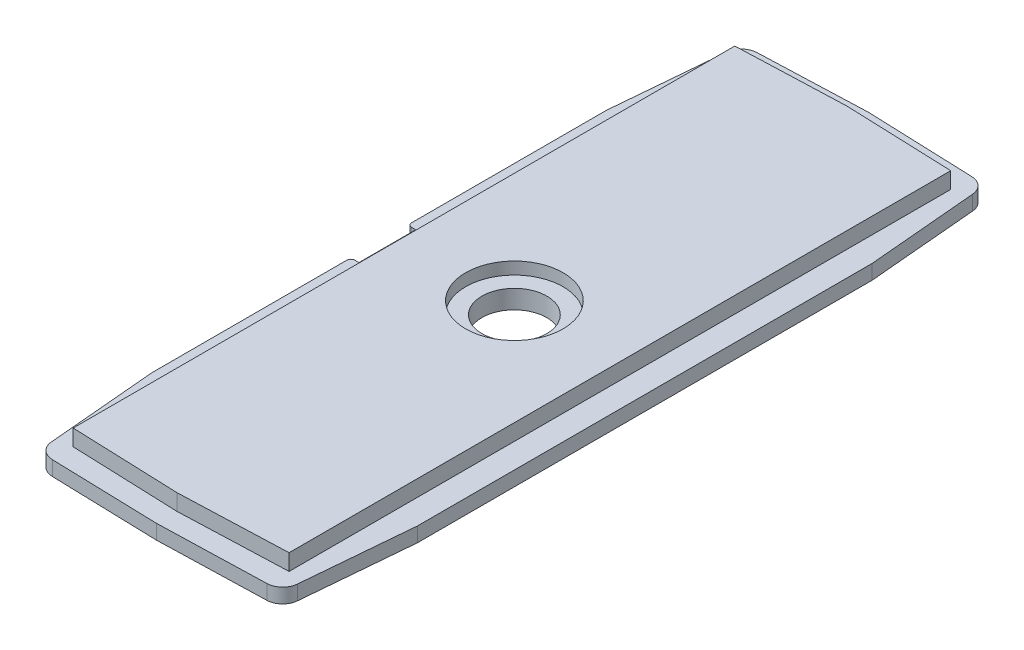
ISO-10303-21;
HEADER;
FILE_DESCRIPTION(('STEP AP214'),'2;1');
FILE_NAME('part.step','',(''),(''),'','','');
FILE_SCHEMA(('AUTOMOTIVE_DESIGN { 1 0 10303 214 1 1 1 1 }'));
ENDSEC;
DATA;
#1=APPLICATION_CONTEXT('core data for automotive mechanical design processes');
#2=APPLICATION_PROTOCOL_DEFINITION('international standard','automotive_design',2000,#1);
#3=PRODUCT_CONTEXT('',#1,'mechanical');
#4=PRODUCT('Part','Part','',(#3));
#5=PRODUCT_RELATED_PRODUCT_CATEGORY('part','',(#4));
#6=PRODUCT_DEFINITION_FORMATION('','',#4);
#7=PRODUCT_DEFINITION_CONTEXT('part definition',#1,'design');
#8=PRODUCT_DEFINITION('design','',#6,#7);
#9=PRODUCT_DEFINITION_SHAPE('','',#8);
#10=(LENGTH_UNIT() NAMED_UNIT(*) SI_UNIT(.MILLI.,.METRE.));
#11=(NAMED_UNIT(*) PLANE_ANGLE_UNIT() SI_UNIT($,.RADIAN.));
#12=(NAMED_UNIT(*) SI_UNIT($,.STERADIAN.) SOLID_ANGLE_UNIT());
#13=UNCERTAINTY_MEASURE_WITH_UNIT(LENGTH_MEASURE(1.E-05),#10,'distance_accuracy_value','');
#14=(GEOMETRIC_REPRESENTATION_CONTEXT(3) GLOBAL_UNCERTAINTY_ASSIGNED_CONTEXT((#13)) GLOBAL_UNIT_ASSIGNED_CONTEXT((#10,
#11,#12)) REPRESENTATION_CONTEXT('',''));
#15=CARTESIAN_POINT('',(0.,0.,0.));
#16=DIRECTION('',(0.,0.,1.));
#17=DIRECTION('',(1.,0.,0.));
#18=AXIS2_PLACEMENT_3D('',#15,#16,#17);
#19=CARTESIAN_POINT('',(0.300000000000007,-0.2,0.));
#20=DIRECTION('',(0.,1.,0.));
#21=DIRECTION('',(0.,0.,1.));
#22=AXIS2_PLACEMENT_3D('',#19,#20,#21);
#23=CYLINDRICAL_SURFACE('',#22,4.);
#24=CARTESIAN_POINT('',(0.300000000000007,0.,0.));
#25=DIRECTION('',(0.,1.,0.));
#26=DIRECTION('',(0.,0.,1.));
#27=AXIS2_PLACEMENT_3D('',#24,#25,#26);
#28=CIRCLE('',#27,4.);
#29=CARTESIAN_POINT('',(0.300000000000007,0.,4.));
#30=VERTEX_POINT('',#29);
#31=EDGE_CURVE('E226',#30,#30,#28,.T.);
#32=ORIENTED_EDGE('',*,*,#31,.F.);
#33=EDGE_LOOP('',(#32));
#34=FACE_BOUND('',#33,.T.);
#35=CARTESIAN_POINT('',(0.300000000000007,2.3,0.));
#36=DIRECTION('',(0.,1.,0.));
#37=DIRECTION('',(0.,0.,1.));
#38=AXIS2_PLACEMENT_3D('',#35,#36,#37);
#39=CIRCLE('',#38,4.);
#40=CARTESIAN_POINT('',(0.300000000000007,2.3,4.));
#41=VERTEX_POINT('',#40);
#42=EDGE_CURVE('E35',#41,#41,#39,.F.);
#43=ORIENTED_EDGE('',*,*,#42,.F.);
#44=EDGE_LOOP('',(#43));
#45=FACE_BOUND('',#44,.T.);
#46=ADVANCED_FACE('F31',(#34,#45),#23,.F.);
#47=CARTESIAN_POINT('',(-15.85,1.8,-4.));
#48=DIRECTION('',(0.,1.,0.));
#49=DIRECTION('',(0.,0.,1.));
#50=AXIS2_PLACEMENT_3D('',#47,#48,#49);
#51=PLANE('',#50);
#52=DIRECTION('',(0.99958153428252,0.,-0.0289267405941802));
#53=VECTOR('',#52,1.);
#54=CARTESIAN_POINT('',(0.,1.8,43.7846989275499));
#55=LINE('',#54,#53);
#56=CARTESIAN_POINT('',(0.,1.8,43.7846989275499));
#57=VERTEX_POINT('',#56);
#58=CARTESIAN_POINT('',(13.2214227765586,1.8,43.4020861502761));
#59=VERTEX_POINT('',#58);
#60=EDGE_CURVE('E269',#57,#59,#55,.T.);
#61=ORIENTED_EDGE('',*,*,#60,.T.);
#62=CARTESIAN_POINT('',(13.1635692953702,1.8,41.402923081711));
#63=DIRECTION('',(0.,1.,0.));
#64=DIRECTION('',(0.,0.,1.));
#65=AXIS2_PLACEMENT_3D('',#62,#63,#64);
#66=CIRCLE('',#65,2.);
#67=CARTESIAN_POINT('',(15.1558796625118,1.8,41.5781355269885));
#68=VERTEX_POINT('',#67);
#69=EDGE_CURVE('E377',#59,#68,#66,.T.);
#70=ORIENTED_EDGE('',*,*,#69,.T.);
#71=DIRECTION('',(0.0876062226387284,0.,-0.9961551835708));
#72=VECTOR('',#71,1.);
#73=CARTESIAN_POINT('',(15.,1.8,43.3506161698846));
#74=LINE('',#73,#72);
#75=CARTESIAN_POINT('',(16.35,1.8,28.));
#76=VERTEX_POINT('',#75);
#77=EDGE_CURVE('E272',#68,#76,#74,.T.);
#78=ORIENTED_EDGE('',*,*,#77,.T.);
#79=DIRECTION('',(0.,0.,-1.));
#80=VECTOR('',#79,1.);
#81=CARTESIAN_POINT('',(16.35,1.8,28.));
#82=LINE('',#81,#80);
#83=CARTESIAN_POINT('',(16.35,1.8,-28.));
#84=VERTEX_POINT('',#83);
#85=EDGE_CURVE('E274',#76,#84,#82,.T.);
#86=ORIENTED_EDGE('',*,*,#85,.T.);
#87=DIRECTION('',(-0.0876132083473841,0.,-0.996154569192491));
#88=VECTOR('',#87,1.);
#89=CARTESIAN_POINT('',(16.35,1.8,-28.));
#90=LINE('',#89,#88);
#91=CARTESIAN_POINT('',(15.1545183752427,1.8,-41.5925222389507));
#92=VERTEX_POINT('',#91);
#93=EDGE_CURVE('E276',#84,#92,#90,.T.);
#94=ORIENTED_EDGE('',*,*,#93,.T.);
#95=CARTESIAN_POINT('',(13.1622092368577,1.8,-41.4172958222559));
#96=DIRECTION('',(0.,1.,0.));
#97=DIRECTION('',(0.,0.,1.));
#98=AXIS2_PLACEMENT_3D('',#95,#96,#97);
#99=CIRCLE('',#98,2.);
#100=CARTESIAN_POINT('',(13.2376113695261,1.8,-43.4158739464204));
#101=VERTEX_POINT('',#100);
#102=EDGE_CURVE('E372',#92,#101,#99,.T.);
#103=ORIENTED_EDGE('',*,*,#102,.T.);
#104=DIRECTION('',(-0.999289062082271,0.,-0.0377010663341814));
#105=VECTOR('',#104,1.);
#106=CARTESIAN_POINT('',(15.,1.8,-43.3493827446398));
#107=LINE('',#106,#105);
#108=CARTESIAN_POINT('',(0.,1.8,-43.9153010724501));
#109=VERTEX_POINT('',#108);
#110=EDGE_CURVE('E279',#101,#109,#107,.T.);
#111=ORIENTED_EDGE('',*,*,#110,.T.);
#112=DIRECTION('',(-0.999289062082271,0.,0.0377010663341814));
#113=VECTOR('',#112,1.);
#114=CARTESIAN_POINT('',(0.,1.8,-43.9153010724501));
#115=LINE('',#114,#113);
#116=CARTESIAN_POINT('',(-13.2376113695261,1.8,-43.4158739464204));
#117=VERTEX_POINT('',#116);
#118=EDGE_CURVE('E281',#109,#117,#115,.T.);
#119=ORIENTED_EDGE('',*,*,#118,.T.);
#120=CARTESIAN_POINT('',(-13.1622092368577,1.8,-41.4172958222559));
#121=DIRECTION('',(0.,1.,0.));
#122=DIRECTION('',(0.,0.,1.));
#123=AXIS2_PLACEMENT_3D('',#120,#121,#122);
#124=CIRCLE('',#123,2.);
#125=CARTESIAN_POINT('',(-15.1545183752427,1.8,-41.5925222389507));
#126=VERTEX_POINT('',#125);
#127=EDGE_CURVE('E47',#117,#126,#124,.T.);
#128=ORIENTED_EDGE('',*,*,#127,.T.);
#129=DIRECTION('',(-0.0876132083473841,0.,0.996154569192491));
#130=VECTOR('',#129,1.);
#131=CARTESIAN_POINT('',(-15.,1.8,-43.3493827446398));
#132=LINE('',#131,#130);
#133=CARTESIAN_POINT('',(-16.35,1.8,-28.));
#134=VERTEX_POINT('',#133);
#135=EDGE_CURVE('E283',#126,#134,#132,.T.);
#136=ORIENTED_EDGE('',*,*,#135,.T.);
#137=DIRECTION('',(0.,0.,1.));
#138=VECTOR('',#137,1.);
#139=CARTESIAN_POINT('',(-16.35,1.8,-28.));
#140=LINE('',#139,#138);
#141=CARTESIAN_POINT('',(-16.35,1.8,-4.));
#142=VERTEX_POINT('',#141);
#143=EDGE_CURVE('E285',#134,#142,#140,.T.);
#144=ORIENTED_EDGE('',*,*,#143,.T.);
#145=CARTESIAN_POINT('',(-15.85,1.8,-4.));
#146=DIRECTION('',(0.,1.,0.));
#147=DIRECTION('',(0.,0.,1.));
#148=AXIS2_PLACEMENT_3D('',#145,#146,#147);
#149=CIRCLE('',#148,0.5);
#150=CARTESIAN_POINT('',(-15.85,1.8,-3.5));
#151=VERTEX_POINT('',#150);
#152=EDGE_CURVE('E287',#142,#151,#149,.T.);
#153=ORIENTED_EDGE('',*,*,#152,.T.);
#154=DIRECTION('',(1.,0.,0.));
#155=VECTOR('',#154,1.);
#156=CARTESIAN_POINT('',(-15.35,1.8,-3.5));
#157=LINE('',#156,#155);
#158=CARTESIAN_POINT('',(-15.35,1.8,-3.5));
#159=VERTEX_POINT('',#158);
#160=EDGE_CURVE('E252',#151,#159,#157,.T.);
#161=ORIENTED_EDGE('',*,*,#160,.T.);
#162=DIRECTION('',(0.,0.,1.));
#163=VECTOR('',#162,1.);
#164=CARTESIAN_POINT('',(-15.35,1.8,-3.5));
#165=LINE('',#164,#163);
#166=CARTESIAN_POINT('',(-15.35,1.8,3.5));
#167=VERTEX_POINT('',#166);
#168=EDGE_CURVE('E255',#159,#167,#165,.T.);
#169=ORIENTED_EDGE('',*,*,#168,.T.);
#170=DIRECTION('',(-1.,0.,0.));
#171=VECTOR('',#170,1.);
#172=CARTESIAN_POINT('',(-15.35,1.8,3.5));
#173=LINE('',#172,#171);
#174=CARTESIAN_POINT('',(-15.85,1.8,3.5));
#175=VERTEX_POINT('',#174);
#176=EDGE_CURVE('E258',#167,#175,#173,.T.);
#177=ORIENTED_EDGE('',*,*,#176,.T.);
#178=CARTESIAN_POINT('',(-15.85,1.8,4.));
#179=DIRECTION('',(0.,1.,0.));
#180=DIRECTION('',(0.,0.,-1.));
#181=AXIS2_PLACEMENT_3D('',#178,#179,#180);
#182=CIRCLE('',#181,0.5);
#183=CARTESIAN_POINT('',(-16.35,1.8,4.));
#184=VERTEX_POINT('',#183);
#185=EDGE_CURVE('E260',#175,#184,#182,.T.);
#186=ORIENTED_EDGE('',*,*,#185,.T.);
#187=DIRECTION('',(0.,0.,1.));
#188=VECTOR('',#187,1.);
#189=CARTESIAN_POINT('',(-16.35,1.8,4.));
#190=LINE('',#189,#188);
#191=CARTESIAN_POINT('',(-16.35,1.8,28.));
#192=VERTEX_POINT('',#191);
#193=EDGE_CURVE('E262',#184,#192,#190,.T.);
#194=ORIENTED_EDGE('',*,*,#193,.T.);
#195=DIRECTION('',(0.0876062226387304,0.,0.996155183570799));
#196=VECTOR('',#195,1.);
#197=CARTESIAN_POINT('',(-16.35,1.8,28.));
#198=LINE('',#197,#196);
#199=CARTESIAN_POINT('',(-15.1558796625118,1.8,41.5781355269885));
#200=VERTEX_POINT('',#199);
#201=EDGE_CURVE('E264',#192,#200,#198,.T.);
#202=ORIENTED_EDGE('',*,*,#201,.T.);
#203=CARTESIAN_POINT('',(-13.1635692953702,1.8,41.402923081711));
#204=DIRECTION('',(0.,1.,0.));
#205=DIRECTION('',(0.,0.,1.));
#206=AXIS2_PLACEMENT_3D('',#203,#204,#205);
#207=CIRCLE('',#206,2.);
#208=CARTESIAN_POINT('',(-13.2214227765585,1.8,43.4020861502761));
#209=VERTEX_POINT('',#208);
#210=EDGE_CURVE('E375',#200,#209,#207,.T.);
#211=ORIENTED_EDGE('',*,*,#210,.T.);
#212=DIRECTION('',(0.99958153428252,0.,0.0289267405941803));
#213=VECTOR('',#212,1.);
#214=CARTESIAN_POINT('',(-15.,1.8,43.3506161698846));
#215=LINE('',#214,#213);
#216=EDGE_CURVE('E267',#209,#57,#215,.T.);
#217=ORIENTED_EDGE('',*,*,#216,.T.);
#218=EDGE_LOOP('',(#61,#70,#78,#86,#94,#103,#111,#119,#128,#136,#144,#153,#161,#169,#177,#186,
#194,#202,#211,#217));
#219=FACE_BOUND('',#218,.T.);
#220=DIRECTION('',(0.,0.,-1.));
#221=VECTOR('',#220,1.);
#222=CARTESIAN_POINT('',(-13.3,1.8,-4.));
#223=LINE('',#222,#221);
#224=CARTESIAN_POINT('',(-13.3,1.8,40.75));
#225=VERTEX_POINT('',#224);
#226=CARTESIAN_POINT('',(-13.3,1.8,-40.75));
#227=VERTEX_POINT('',#226);
#228=EDGE_CURVE('E248',#225,#227,#223,.T.);
#229=ORIENTED_EDGE('',*,*,#228,.T.);
#230=DIRECTION('',(0.999294094305728,0.,-0.0375674471543507));
#231=VECTOR('',#230,1.);
#232=CARTESIAN_POINT('',(-17.2260302585526,1.8,-40.602404877498));
#233=LINE('',#232,#231);
#234=CARTESIAN_POINT('',(0.,1.8,-41.25));
#235=VERTEX_POINT('',#234);
#236=EDGE_CURVE('E230',#227,#235,#233,.T.);
#237=ORIENTED_EDGE('',*,*,#236,.T.);
#238=DIRECTION('',(0.999294094305728,0.,0.0375674471543507));
#239=VECTOR('',#238,1.);
#240=CARTESIAN_POINT('',(-14.4292311166309,1.8,-41.7924522976177));
#241=LINE('',#240,#239);
#242=CARTESIAN_POINT('',(13.3,1.8,-40.75));
#243=VERTEX_POINT('',#242);
#244=EDGE_CURVE('E231',#235,#243,#241,.T.);
#245=ORIENTED_EDGE('',*,*,#244,.T.);
#246=DIRECTION('',(0.,0.,1.));
#247=VECTOR('',#246,1.);
#248=CARTESIAN_POINT('',(13.3,1.8,-4.));
#249=LINE('',#248,#247);
#250=CARTESIAN_POINT('',(13.3,1.8,40.75));
#251=VERTEX_POINT('',#250);
#252=EDGE_CURVE('E234',#243,#251,#249,.T.);
#253=ORIENTED_EDGE('',*,*,#252,.T.);
#254=DIRECTION('',(-0.999294094305728,0.,0.0375674471543507));
#255=VECTOR('',#254,1.);
#256=CARTESIAN_POINT('',(-14.128903691995,1.8,41.7811617929321));
#257=LINE('',#256,#255);
#258=CARTESIAN_POINT('',(0.,1.8,41.25));
#259=VERTEX_POINT('',#258);
#260=EDGE_CURVE('E242',#251,#259,#257,.T.);
#261=ORIENTED_EDGE('',*,*,#260,.T.);
#262=DIRECTION('',(-0.999294094305728,0.,-0.0375674471543507));
#263=VECTOR('',#262,1.);
#264=CARTESIAN_POINT('',(-17.5263576831884,1.8,40.5911143728125));
#265=LINE('',#264,#263);
#266=EDGE_CURVE('E245',#259,#225,#265,.T.);
#267=ORIENTED_EDGE('',*,*,#266,.T.);
#268=EDGE_LOOP('',(#229,#237,#245,#253,#261,#267));
#269=FACE_BOUND('',#268,.T.);
#270=ADVANCED_FACE('F422',(#219,#269),#51,.T.);
#271=CARTESIAN_POINT('',(-15.35,1.8,-3.5));
#272=DIRECTION('',(0.,0.,-1.));
#273=DIRECTION('',(-1.,0.,0.));
#274=AXIS2_PLACEMENT_3D('',#271,#272,#273);
#275=PLANE('',#274);
#276=DIRECTION('',(1.,0.,0.));
#277=VECTOR('',#276,1.);
#278=CARTESIAN_POINT('',(-15.35,0.,-3.5));
#279=LINE('',#278,#277);
#280=CARTESIAN_POINT('',(-15.85,0.,-3.5));
#281=VERTEX_POINT('',#280);
#282=CARTESIAN_POINT('',(-15.35,0.,-3.5));
#283=VERTEX_POINT('',#282);
#284=EDGE_CURVE('E251',#281,#283,#279,.T.);
#285=ORIENTED_EDGE('',*,*,#284,.T.);
#286=DIRECTION('',(0.,-1.,0.));
#287=VECTOR('',#286,1.);
#288=CARTESIAN_POINT('',(-15.35,1.8,-3.5));
#289=LINE('',#288,#287);
#290=EDGE_CURVE('E356',#159,#283,#289,.T.);
#291=ORIENTED_EDGE('',*,*,#290,.F.);
#292=ORIENTED_EDGE('',*,*,#160,.F.);
#293=DIRECTION('',(0.,-1.,0.));
#294=VECTOR('',#293,1.);
#295=CARTESIAN_POINT('',(-15.85,1.8,-3.5));
#296=LINE('',#295,#294);
#297=EDGE_CURVE('E289',#151,#281,#296,.T.);
#298=ORIENTED_EDGE('',*,*,#297,.T.);
#299=EDGE_LOOP('',(#285,#291,#292,#298));
#300=FACE_BOUND('',#299,.T.);
#301=ADVANCED_FACE('F427',(#300),#275,.F.);
#302=CARTESIAN_POINT('',(-15.35,1.8,-3.5));
#303=DIRECTION('',(1.,0.,0.));
#304=DIRECTION('',(0.,0.,-1.));
#305=AXIS2_PLACEMENT_3D('',#302,#303,#304);
#306=PLANE('',#305);
#307=DIRECTION('',(0.,0.,1.));
#308=VECTOR('',#307,1.);
#309=CARTESIAN_POINT('',(-15.35,0.,-3.5));
#310=LINE('',#309,#308);
#311=CARTESIAN_POINT('',(-15.35,0.,3.5));
#312=VERTEX_POINT('',#311);
#313=EDGE_CURVE('E292',#283,#312,#310,.T.);
#314=ORIENTED_EDGE('',*,*,#313,.T.);
#315=DIRECTION('',(0.,-1.,0.));
#316=VECTOR('',#315,1.);
#317=CARTESIAN_POINT('',(-15.35,1.8,3.5));
#318=LINE('',#317,#316);
#319=EDGE_CURVE('E353',#167,#312,#318,.T.);
#320=ORIENTED_EDGE('',*,*,#319,.F.);
#321=ORIENTED_EDGE('',*,*,#168,.F.);
#322=ORIENTED_EDGE('',*,*,#290,.T.);
#323=EDGE_LOOP('',(#314,#320,#321,#322));
#324=FACE_BOUND('',#323,.T.);
#325=ADVANCED_FACE('F429',(#324),#306,.F.);
#326=CARTESIAN_POINT('',(-15.35,1.8,3.5));
#327=DIRECTION('',(0.,0.,1.));
#328=DIRECTION('',(1.,0.,0.));
#329=AXIS2_PLACEMENT_3D('',#326,#327,#328);
#330=PLANE('',#329);
#331=DIRECTION('',(-1.,0.,0.));
#332=VECTOR('',#331,1.);
#333=CARTESIAN_POINT('',(-15.35,0.,3.5));
#334=LINE('',#333,#332);
#335=CARTESIAN_POINT('',(-15.85,0.,3.5));
#336=VERTEX_POINT('',#335);
#337=EDGE_CURVE('E294',#312,#336,#334,.T.);
#338=ORIENTED_EDGE('',*,*,#337,.T.);
#339=DIRECTION('',(0.,-1.,0.));
#340=VECTOR('',#339,1.);
#341=CARTESIAN_POINT('',(-15.85,1.8,3.5));
#342=LINE('',#341,#340);
#343=EDGE_CURVE('E350',#175,#336,#342,.T.);
#344=ORIENTED_EDGE('',*,*,#343,.F.);
#345=ORIENTED_EDGE('',*,*,#176,.F.);
#346=ORIENTED_EDGE('',*,*,#319,.T.);
#347=EDGE_LOOP('',(#338,#344,#345,#346));
#348=FACE_BOUND('',#347,.T.);
#349=ADVANCED_FACE('F434',(#348),#330,.F.);
#350=CARTESIAN_POINT('',(-15.85,1.8,4.));
#351=DIRECTION('',(0.,-1.,0.));
#352=DIRECTION('',(0.,0.,-1.));
#353=AXIS2_PLACEMENT_3D('',#350,#351,#352);
#354=CYLINDRICAL_SURFACE('',#353,0.5);
#355=CARTESIAN_POINT('',(-15.85,0.,4.));
#356=DIRECTION('',(0.,1.,0.));
#357=DIRECTION('',(0.,0.,-1.));
#358=AXIS2_PLACEMENT_3D('',#355,#356,#357);
#359=CIRCLE('',#358,0.5);
#360=CARTESIAN_POINT('',(-16.35,0.,4.));
#361=VERTEX_POINT('',#360);
#362=EDGE_CURVE('E296',#336,#361,#359,.T.);
#363=ORIENTED_EDGE('',*,*,#362,.T.);
#364=DIRECTION('',(0.,-1.,0.));
#365=VECTOR('',#364,1.);
#366=CARTESIAN_POINT('',(-16.35,1.8,4.));
#367=LINE('',#366,#365);
#368=EDGE_CURVE('E347',#184,#361,#367,.T.);
#369=ORIENTED_EDGE('',*,*,#368,.F.);
#370=ORIENTED_EDGE('',*,*,#185,.F.);
#371=ORIENTED_EDGE('',*,*,#343,.T.);
#372=EDGE_LOOP('',(#363,#369,#370,#371));
#373=FACE_BOUND('',#372,.T.);
#374=ADVANCED_FACE('F440',(#373),#354,.T.);
#375=CARTESIAN_POINT('',(-16.35,1.8,4.));
#376=DIRECTION('',(1.,0.,0.));
#377=DIRECTION('',(0.,0.,-1.));
#378=AXIS2_PLACEMENT_3D('',#375,#376,#377);
#379=PLANE('',#378);
#380=DIRECTION('',(0.,0.,1.));
#381=VECTOR('',#380,1.);
#382=CARTESIAN_POINT('',(-16.35,0.,4.));
#383=LINE('',#382,#381);
#384=CARTESIAN_POINT('',(-16.35,0.,28.));
#385=VERTEX_POINT('',#384);
#386=EDGE_CURVE('E298',#361,#385,#383,.T.);
#387=ORIENTED_EDGE('',*,*,#386,.T.);
#388=DIRECTION('',(0.,-1.,0.));
#389=VECTOR('',#388,1.);
#390=CARTESIAN_POINT('',(-16.35,1.8,28.));
#391=LINE('',#390,#389);
#392=EDGE_CURVE('E344',#192,#385,#391,.T.);
#393=ORIENTED_EDGE('',*,*,#392,.F.);
#394=ORIENTED_EDGE('',*,*,#193,.F.);
#395=ORIENTED_EDGE('',*,*,#368,.T.);
#396=EDGE_LOOP('',(#387,#393,#394,#395));
#397=FACE_BOUND('',#396,.T.);
#398=ADVANCED_FACE('F444',(#397),#379,.F.);
#399=CARTESIAN_POINT('',(-16.35,1.8,28.));
#400=DIRECTION('',(0.996155183570799,0.,-0.0876062226387304));
#401=DIRECTION('',(-0.0876062226387304,0.,-0.996155183570799));
#402=AXIS2_PLACEMENT_3D('',#399,#400,#401);
#403=PLANE('',#402);
#404=DIRECTION('',(0.0876062226387304,0.,0.996155183570799));
#405=VECTOR('',#404,1.);
#406=CARTESIAN_POINT('',(-16.35,0.,28.));
#407=LINE('',#406,#405);
#408=CARTESIAN_POINT('',(-15.1558796625118,0.,41.5781355269885));
#409=VERTEX_POINT('',#408);
#410=EDGE_CURVE('E300',#385,#409,#407,.T.);
#411=ORIENTED_EDGE('',*,*,#410,.T.);
#412=DIRECTION('',(0.,-1.,0.));
#413=VECTOR('',#412,1.);
#414=CARTESIAN_POINT('',(-15.1558796625118,1.8,41.5781355269885));
#415=LINE('',#414,#413);
#416=EDGE_CURVE('E382',#409,#200,#415,.F.);
#417=ORIENTED_EDGE('',*,*,#416,.T.);
#418=ORIENTED_EDGE('',*,*,#201,.F.);
#419=ORIENTED_EDGE('',*,*,#392,.T.);
#420=EDGE_LOOP('',(#411,#417,#418,#419));
#421=FACE_BOUND('',#420,.T.);
#422=ADVANCED_FACE('F448',(#421),#403,.F.);
#423=CARTESIAN_POINT('',(-15.,1.8,43.3506161698846));
#424=DIRECTION('',(0.0289267405941803,0.,-0.99958153428252));
#425=DIRECTION('',(-0.99958153428252,0.,-0.0289267405941803));
#426=AXIS2_PLACEMENT_3D('',#423,#424,#425);
#427=PLANE('',#426);
#428=ORIENTED_EDGE('',*,*,#216,.F.);
#429=DIRECTION('',(0.,-1.,0.));
#430=VECTOR('',#429,1.);
#431=CARTESIAN_POINT('',(-13.2214227765585,1.8,43.4020861502761));
#432=LINE('',#431,#430);
#433=CARTESIAN_POINT('',(-13.2214227765585,0.,43.4020861502761));
#434=VERTEX_POINT('',#433);
#435=EDGE_CURVE('E379',#209,#434,#432,.T.);
#436=ORIENTED_EDGE('',*,*,#435,.T.);
#437=DIRECTION('',(0.99958153428252,0.,0.0289267405941803));
#438=VECTOR('',#437,1.);
#439=CARTESIAN_POINT('',(-15.,0.,43.3506161698846));
#440=LINE('',#439,#438);
#441=CARTESIAN_POINT('',(0.,0.,43.7846989275499));
#442=VERTEX_POINT('',#441);
#443=EDGE_CURVE('E303',#434,#442,#440,.T.);
#444=ORIENTED_EDGE('',*,*,#443,.T.);
#445=DIRECTION('',(0.,-1.,0.));
#446=VECTOR('',#445,1.);
#447=CARTESIAN_POINT('',(0.,1.8,43.7846989275499));
#448=LINE('',#447,#446);
#449=EDGE_CURVE('E341',#57,#442,#448,.T.);
#450=ORIENTED_EDGE('',*,*,#449,.F.);
#451=EDGE_LOOP('',(#428,#436,#444,#450));
#452=FACE_BOUND('',#451,.T.);
#453=ADVANCED_FACE('F457',(#452),#427,.F.);
#454=CARTESIAN_POINT('',(0.,1.8,43.7846989275499));
#455=DIRECTION('',(-0.0289267405941802,0.,-0.99958153428252));
#456=DIRECTION('',(-0.99958153428252,0.,0.0289267405941802));
#457=AXIS2_PLACEMENT_3D('',#454,#455,#456);
#458=PLANE('',#457);
#459=DIRECTION('',(0.99958153428252,0.,-0.0289267405941802));
#460=VECTOR('',#459,1.);
#461=CARTESIAN_POINT('',(0.,0.,43.7846989275499));
#462=LINE('',#461,#460);
#463=CARTESIAN_POINT('',(13.2214227765586,0.,43.4020861502761));
#464=VERTEX_POINT('',#463);
#465=EDGE_CURVE('E305',#442,#464,#462,.T.);
#466=ORIENTED_EDGE('',*,*,#465,.T.);
#467=DIRECTION('',(0.,-1.,0.));
#468=VECTOR('',#467,1.);
#469=CARTESIAN_POINT('',(13.2214227765586,1.8,43.4020861502761));
#470=LINE('',#469,#468);
#471=EDGE_CURVE('E370',#464,#59,#470,.F.);
#472=ORIENTED_EDGE('',*,*,#471,.T.);
#473=ORIENTED_EDGE('',*,*,#60,.F.);
#474=ORIENTED_EDGE('',*,*,#449,.T.);
#475=EDGE_LOOP('',(#466,#472,#473,#474));
#476=FACE_BOUND('',#475,.T.);
#477=ADVANCED_FACE('F462',(#476),#458,.F.);
#478=CARTESIAN_POINT('',(15.,1.8,43.3506161698846));
#479=DIRECTION('',(-0.9961551835708,0.,-0.0876062226387284));
#480=DIRECTION('',(-0.0876062226387284,0.,0.9961551835708));
#481=AXIS2_PLACEMENT_3D('',#478,#479,#480);
#482=PLANE('',#481);
#483=ORIENTED_EDGE('',*,*,#77,.F.);
#484=DIRECTION('',(0.,-1.,0.));
#485=VECTOR('',#484,1.);
#486=CARTESIAN_POINT('',(15.1558796625118,1.8,41.5781355269885));
#487=LINE('',#486,#485);
#488=CARTESIAN_POINT('',(15.1558796625118,0.,41.5781355269885));
#489=VERTEX_POINT('',#488);
#490=EDGE_CURVE('E359',#68,#489,#487,.T.);
#491=ORIENTED_EDGE('',*,*,#490,.T.);
#492=DIRECTION('',(0.0876062226387284,0.,-0.9961551835708));
#493=VECTOR('',#492,1.);
#494=CARTESIAN_POINT('',(15.,0.,43.3506161698846));
#495=LINE('',#494,#493);
#496=CARTESIAN_POINT('',(16.35,0.,28.));
#497=VERTEX_POINT('',#496);
#498=EDGE_CURVE('E308',#489,#497,#495,.T.);
#499=ORIENTED_EDGE('',*,*,#498,.T.);
#500=DIRECTION('',(0.,-1.,0.));
#501=VECTOR('',#500,1.);
#502=CARTESIAN_POINT('',(16.35,1.8,28.));
#503=LINE('',#502,#501);
#504=EDGE_CURVE('E338',#76,#497,#503,.T.);
#505=ORIENTED_EDGE('',*,*,#504,.F.);
#506=EDGE_LOOP('',(#483,#491,#499,#505));
#507=FACE_BOUND('',#506,.T.);
#508=ADVANCED_FACE('F471',(#507),#482,.F.);
#509=CARTESIAN_POINT('',(16.35,1.8,28.));
#510=DIRECTION('',(-1.,0.,0.));
#511=DIRECTION('',(0.,0.,1.));
#512=AXIS2_PLACEMENT_3D('',#509,#510,#511);
#513=PLANE('',#512);
#514=DIRECTION('',(0.,0.,-1.));
#515=VECTOR('',#514,1.);
#516=CARTESIAN_POINT('',(16.35,0.,28.));
#517=LINE('',#516,#515);
#518=CARTESIAN_POINT('',(16.35,0.,-28.));
#519=VERTEX_POINT('',#518);
#520=EDGE_CURVE('E310',#497,#519,#517,.T.);
#521=ORIENTED_EDGE('',*,*,#520,.T.);
#522=DIRECTION('',(0.,-1.,0.));
#523=VECTOR('',#522,1.);
#524=CARTESIAN_POINT('',(16.35,1.8,-28.));
#525=LINE('',#524,#523);
#526=EDGE_CURVE('E335',#84,#519,#525,.T.);
#527=ORIENTED_EDGE('',*,*,#526,.F.);
#528=ORIENTED_EDGE('',*,*,#85,.F.);
#529=ORIENTED_EDGE('',*,*,#504,.T.);
#530=EDGE_LOOP('',(#521,#527,#528,#529));
#531=FACE_BOUND('',#530,.T.);
#532=ADVANCED_FACE('F476',(#531),#513,.F.);
#533=CARTESIAN_POINT('',(16.35,1.8,-28.));
#534=DIRECTION('',(-0.996154569192491,0.,0.0876132083473841));
#535=DIRECTION('',(0.0876132083473841,0.,0.996154569192491));
#536=AXIS2_PLACEMENT_3D('',#533,#534,#535);
#537=PLANE('',#536);
#538=DIRECTION('',(-0.0876132083473841,0.,-0.996154569192491));
#539=VECTOR('',#538,1.);
#540=CARTESIAN_POINT('',(16.35,0.,-28.));
#541=LINE('',#540,#539);
#542=CARTESIAN_POINT('',(15.1545183752427,0.,-41.5925222389507));
#543=VERTEX_POINT('',#542);
#544=EDGE_CURVE('E312',#519,#543,#541,.T.);
#545=ORIENTED_EDGE('',*,*,#544,.T.);
#546=DIRECTION('',(0.,-1.,0.));
#547=VECTOR('',#546,1.);
#548=CARTESIAN_POINT('',(15.1545183752427,1.8,-41.5925222389507));
#549=LINE('',#548,#547);
#550=EDGE_CURVE('E11',#543,#92,#549,.F.);
#551=ORIENTED_EDGE('',*,*,#550,.T.);
#552=ORIENTED_EDGE('',*,*,#93,.F.);
#553=ORIENTED_EDGE('',*,*,#526,.T.);
#554=EDGE_LOOP('',(#545,#551,#552,#553));
#555=FACE_BOUND('',#554,.T.);
#556=ADVANCED_FACE('F480',(#555),#537,.F.);
#557=CARTESIAN_POINT('',(15.,1.8,-43.3493827446398));
#558=DIRECTION('',(-0.0377010663341814,0.,0.999289062082271));
#559=DIRECTION('',(0.999289062082272,0.,0.0377010663341814));
#560=AXIS2_PLACEMENT_3D('',#557,#558,#559);
#561=PLANE('',#560);
#562=ORIENTED_EDGE('',*,*,#110,.F.);
#563=DIRECTION('',(0.,-1.,0.));
#564=VECTOR('',#563,1.);
#565=CARTESIAN_POINT('',(13.2376113695261,1.8,-43.4158739464204));
#566=LINE('',#565,#564);
#567=CARTESIAN_POINT('',(13.2376113695261,0.,-43.4158739464204));
#568=VERTEX_POINT('',#567);
#569=EDGE_CURVE('E40',#101,#568,#566,.T.);
#570=ORIENTED_EDGE('',*,*,#569,.T.);
#571=DIRECTION('',(-0.999289062082271,0.,-0.0377010663341814));
#572=VECTOR('',#571,1.);
#573=CARTESIAN_POINT('',(15.,0.,-43.3493827446398));
#574=LINE('',#573,#572);
#575=CARTESIAN_POINT('',(0.,0.,-43.9153010724501));
#576=VERTEX_POINT('',#575);
#577=EDGE_CURVE('E315',#568,#576,#574,.T.);
#578=ORIENTED_EDGE('',*,*,#577,.T.);
#579=DIRECTION('',(0.,-1.,0.));
#580=VECTOR('',#579,1.);
#581=CARTESIAN_POINT('',(0.,1.8,-43.9153010724501));
#582=LINE('',#581,#580);
#583=EDGE_CURVE('E332',#109,#576,#582,.T.);
#584=ORIENTED_EDGE('',*,*,#583,.F.);
#585=EDGE_LOOP('',(#562,#570,#578,#584));
#586=FACE_BOUND('',#585,.T.);
#587=ADVANCED_FACE('F393',(#586),#561,.F.);
#588=CARTESIAN_POINT('',(0.,1.8,-43.9153010724501));
#589=DIRECTION('',(0.0377010663341814,0.,0.999289062082271));
#590=DIRECTION('',(0.999289062082272,0.,-0.0377010663341814));
#591=AXIS2_PLACEMENT_3D('',#588,#589,#590);
#592=PLANE('',#591);
#593=DIRECTION('',(-0.999289062082271,0.,0.0377010663341814));
#594=VECTOR('',#593,1.);
#595=CARTESIAN_POINT('',(0.,0.,-43.9153010724501));
#596=LINE('',#595,#594);
#597=CARTESIAN_POINT('',(-13.2376113695261,0.,-43.4158739464204));
#598=VERTEX_POINT('',#597);
#599=EDGE_CURVE('E317',#576,#598,#596,.T.);
#600=ORIENTED_EDGE('',*,*,#599,.T.);
#601=DIRECTION('',(0.,-1.,0.));
#602=VECTOR('',#601,1.);
#603=CARTESIAN_POINT('',(-13.2376113695261,1.8,-43.4158739464204));
#604=LINE('',#603,#602);
#605=EDGE_CURVE('E55',#598,#117,#604,.F.);
#606=ORIENTED_EDGE('',*,*,#605,.T.);
#607=ORIENTED_EDGE('',*,*,#118,.F.);
#608=ORIENTED_EDGE('',*,*,#583,.T.);
#609=EDGE_LOOP('',(#600,#606,#607,#608));
#610=FACE_BOUND('',#609,.T.);
#611=ADVANCED_FACE('F403',(#610),#592,.F.);
#612=CARTESIAN_POINT('',(-15.,1.8,-43.3493827446398));
#613=DIRECTION('',(0.996154569192491,0.,0.0876132083473841));
#614=DIRECTION('',(0.0876132083473841,0.,-0.996154569192491));
#615=AXIS2_PLACEMENT_3D('',#612,#613,#614);
#616=PLANE('',#615);
#617=ORIENTED_EDGE('',*,*,#135,.F.);
#618=DIRECTION('',(0.,-1.,0.));
#619=VECTOR('',#618,1.);
#620=CARTESIAN_POINT('',(-15.1545183752427,1.8,-41.5925222389507));
#621=LINE('',#620,#619);
#622=CARTESIAN_POINT('',(-15.1545183752427,0.,-41.5925222389507));
#623=VERTEX_POINT('',#622);
#624=EDGE_CURVE('E384',#126,#623,#621,.T.);
#625=ORIENTED_EDGE('',*,*,#624,.T.);
#626=DIRECTION('',(-0.0876132083473841,0.,0.996154569192491));
#627=VECTOR('',#626,1.);
#628=CARTESIAN_POINT('',(-15.,0.,-43.3493827446398));
#629=LINE('',#628,#627);
#630=CARTESIAN_POINT('',(-16.35,0.,-28.));
#631=VERTEX_POINT('',#630);
#632=EDGE_CURVE('E319',#623,#631,#629,.T.);
#633=ORIENTED_EDGE('',*,*,#632,.T.);
#634=DIRECTION('',(0.,-1.,0.));
#635=VECTOR('',#634,1.);
#636=CARTESIAN_POINT('',(-16.35,1.8,-28.));
#637=LINE('',#636,#635);
#638=EDGE_CURVE('E329',#134,#631,#637,.T.);
#639=ORIENTED_EDGE('',*,*,#638,.F.);
#640=EDGE_LOOP('',(#617,#625,#633,#639));
#641=FACE_BOUND('',#640,.T.);
#642=ADVANCED_FACE('F408',(#641),#616,.F.);
#643=CARTESIAN_POINT('',(-16.35,1.8,-28.));
#644=DIRECTION('',(1.,0.,0.));
#645=DIRECTION('',(0.,0.,-1.));
#646=AXIS2_PLACEMENT_3D('',#643,#644,#645);
#647=PLANE('',#646);
#648=DIRECTION('',(0.,0.,1.));
#649=VECTOR('',#648,1.);
#650=CARTESIAN_POINT('',(-16.35,0.,-28.));
#651=LINE('',#650,#649);
#652=CARTESIAN_POINT('',(-16.35,0.,-4.));
#653=VERTEX_POINT('',#652);
#654=EDGE_CURVE('E321',#631,#653,#651,.T.);
#655=ORIENTED_EDGE('',*,*,#654,.T.);
#656=DIRECTION('',(0.,-1.,0.));
#657=VECTOR('',#656,1.);
#658=CARTESIAN_POINT('',(-16.35,1.8,-4.));
#659=LINE('',#658,#657);
#660=EDGE_CURVE('E326',#142,#653,#659,.T.);
#661=ORIENTED_EDGE('',*,*,#660,.F.);
#662=ORIENTED_EDGE('',*,*,#143,.F.);
#663=ORIENTED_EDGE('',*,*,#638,.T.);
#664=EDGE_LOOP('',(#655,#661,#662,#663));
#665=FACE_BOUND('',#664,.T.);
#666=ADVANCED_FACE('F415',(#665),#647,.F.);
#667=CARTESIAN_POINT('',(-15.85,1.8,-4.));
#668=DIRECTION('',(0.,-1.,0.));
#669=DIRECTION('',(0.,0.,-1.));
#670=AXIS2_PLACEMENT_3D('',#667,#668,#669);
#671=CYLINDRICAL_SURFACE('',#670,0.5);
#672=CARTESIAN_POINT('',(-15.85,0.,-4.));
#673=DIRECTION('',(0.,1.,0.));
#674=DIRECTION('',(0.,0.,1.));
#675=AXIS2_PLACEMENT_3D('',#672,#673,#674);
#676=CIRCLE('',#675,0.5);
#677=EDGE_CURVE('E256',#653,#281,#676,.T.);
#678=ORIENTED_EDGE('',*,*,#677,.T.);
#679=ORIENTED_EDGE('',*,*,#297,.F.);
#680=ORIENTED_EDGE('',*,*,#152,.F.);
#681=ORIENTED_EDGE('',*,*,#660,.T.);
#682=EDGE_LOOP('',(#678,#679,#680,#681));
#683=FACE_BOUND('',#682,.T.);
#684=ADVANCED_FACE('F419',(#683),#671,.T.);
#685=CARTESIAN_POINT('',(-15.85,0.,-4.));
#686=DIRECTION('',(0.,1.,0.));
#687=DIRECTION('',(0.,0.,1.));
#688=AXIS2_PLACEMENT_3D('',#685,#686,#687);
#689=PLANE('',#688);
#690=ORIENTED_EDGE('',*,*,#31,.T.);
#691=EDGE_LOOP('',(#690));
#692=FACE_BOUND('',#691,.T.);
#693=ORIENTED_EDGE('',*,*,#498,.F.);
#694=CARTESIAN_POINT('',(13.1635692953702,0.,41.402923081711));
#695=DIRECTION('',(0.,1.,0.));
#696=DIRECTION('',(0.,0.,1.));
#697=AXIS2_PLACEMENT_3D('',#694,#695,#696);
#698=CIRCLE('',#697,2.);
#699=EDGE_CURVE('E368',#489,#464,#698,.F.);
#700=ORIENTED_EDGE('',*,*,#699,.T.);
#701=ORIENTED_EDGE('',*,*,#465,.F.);
#702=ORIENTED_EDGE('',*,*,#443,.F.);
#703=CARTESIAN_POINT('',(-13.1635692953702,0.,41.402923081711));
#704=DIRECTION('',(0.,1.,0.));
#705=DIRECTION('',(0.,0.,1.));
#706=AXIS2_PLACEMENT_3D('',#703,#704,#705);
#707=CIRCLE('',#706,2.);
#708=EDGE_CURVE('E366',#434,#409,#707,.F.);
#709=ORIENTED_EDGE('',*,*,#708,.T.);
#710=ORIENTED_EDGE('',*,*,#410,.F.);
#711=ORIENTED_EDGE('',*,*,#386,.F.);
#712=ORIENTED_EDGE('',*,*,#362,.F.);
#713=ORIENTED_EDGE('',*,*,#337,.F.);
#714=ORIENTED_EDGE('',*,*,#313,.F.);
#715=ORIENTED_EDGE('',*,*,#284,.F.);
#716=ORIENTED_EDGE('',*,*,#677,.F.);
#717=ORIENTED_EDGE('',*,*,#654,.F.);
#718=ORIENTED_EDGE('',*,*,#632,.F.);
#719=CARTESIAN_POINT('',(-13.1622092368577,0.,-41.4172958222559));
#720=DIRECTION('',(0.,1.,0.));
#721=DIRECTION('',(0.,0.,1.));
#722=AXIS2_PLACEMENT_3D('',#719,#720,#721);
#723=CIRCLE('',#722,2.);
#724=EDGE_CURVE('E364',#623,#598,#723,.F.);
#725=ORIENTED_EDGE('',*,*,#724,.T.);
#726=ORIENTED_EDGE('',*,*,#599,.F.);
#727=ORIENTED_EDGE('',*,*,#577,.F.);
#728=CARTESIAN_POINT('',(13.1622092368577,0.,-41.4172958222559));
#729=DIRECTION('',(0.,1.,0.));
#730=DIRECTION('',(0.,0.,1.));
#731=AXIS2_PLACEMENT_3D('',#728,#729,#730);
#732=CIRCLE('',#731,2.);
#733=EDGE_CURVE('E362',#568,#543,#732,.F.);
#734=ORIENTED_EDGE('',*,*,#733,.T.);
#735=ORIENTED_EDGE('',*,*,#544,.F.);
#736=ORIENTED_EDGE('',*,*,#520,.F.);
#737=EDGE_LOOP('',(#693,#700,#701,#702,#709,#710,#711,#712,#713,#714,#715,#716,#717,#718,#725,
#726,#727,#734,#735,#736));
#738=FACE_BOUND('',#737,.T.);
#739=ADVANCED_FACE('F400',(#692,#738),#689,.F.);
#740=CARTESIAN_POINT('',(0.,3.8,-41.25));
#741=DIRECTION('',(0.0375674471543507,0.,0.999294094305728));
#742=DIRECTION('',(0.999294094305728,0.,-0.0375674471543507));
#743=AXIS2_PLACEMENT_3D('',#740,#741,#742);
#744=PLANE('',#743);
#745=ORIENTED_EDGE('',*,*,#236,.F.);
#746=DIRECTION('',(0.,-1.,0.));
#747=VECTOR('',#746,1.);
#748=CARTESIAN_POINT('',(-13.3,3.8,-40.75));
#749=LINE('',#748,#747);
#750=CARTESIAN_POINT('',(-13.3,3.8,-40.75));
#751=VERTEX_POINT('',#750);
#752=EDGE_CURVE('E210',#751,#227,#749,.T.);
#753=ORIENTED_EDGE('',*,*,#752,.F.);
#754=DIRECTION('',(-0.999294094305728,0.,0.0375674471543507));
#755=VECTOR('',#754,1.);
#756=CARTESIAN_POINT('',(0.,3.8,-41.25));
#757=LINE('',#756,#755);
#758=CARTESIAN_POINT('',(0.,3.8,-41.25));
#759=VERTEX_POINT('',#758);
#760=EDGE_CURVE('E217',#759,#751,#757,.T.);
#761=ORIENTED_EDGE('',*,*,#760,.F.);
#762=DIRECTION('',(0.,-1.,0.));
#763=VECTOR('',#762,1.);
#764=CARTESIAN_POINT('',(0.,3.8,-41.25));
#765=LINE('',#764,#763);
#766=EDGE_CURVE('E770',#759,#235,#765,.T.);
#767=ORIENTED_EDGE('',*,*,#766,.T.);
#768=EDGE_LOOP('',(#745,#753,#761,#767));
#769=FACE_BOUND('',#768,.T.);
#770=ADVANCED_FACE('F228',(#769),#744,.F.);
#771=CARTESIAN_POINT('',(-13.3,3.8,-40.75));
#772=DIRECTION('',(1.,0.,0.));
#773=DIRECTION('',(0.,0.,-1.));
#774=AXIS2_PLACEMENT_3D('',#771,#772,#773);
#775=PLANE('',#774);
#776=ORIENTED_EDGE('',*,*,#228,.F.);
#777=DIRECTION('',(0.,-1.,0.));
#778=VECTOR('',#777,1.);
#779=CARTESIAN_POINT('',(-13.3,3.8,40.75));
#780=LINE('',#779,#778);
#781=CARTESIAN_POINT('',(-13.3,3.8,40.75));
#782=VERTEX_POINT('',#781);
#783=EDGE_CURVE('E213',#782,#225,#780,.T.);
#784=ORIENTED_EDGE('',*,*,#783,.F.);
#785=DIRECTION('',(0.,0.,1.));
#786=VECTOR('',#785,1.);
#787=CARTESIAN_POINT('',(-13.3,3.8,-40.75));
#788=LINE('',#787,#786);
#789=EDGE_CURVE('E206',#751,#782,#788,.T.);
#790=ORIENTED_EDGE('',*,*,#789,.F.);
#791=ORIENTED_EDGE('',*,*,#752,.T.);
#792=EDGE_LOOP('',(#776,#784,#790,#791));
#793=FACE_BOUND('',#792,.T.);
#794=ADVANCED_FACE('F208',(#793),#775,.F.);
#795=CARTESIAN_POINT('',(-13.3,3.8,40.75));
#796=DIRECTION('',(0.0375674471543507,0.,-0.999294094305728));
#797=DIRECTION('',(-0.999294094305728,0.,-0.0375674471543507));
#798=AXIS2_PLACEMENT_3D('',#795,#796,#797);
#799=PLANE('',#798);
#800=ORIENTED_EDGE('',*,*,#266,.F.);
#801=DIRECTION('',(0.,-1.,0.));
#802=VECTOR('',#801,1.);
#803=CARTESIAN_POINT('',(0.,3.8,41.25));
#804=LINE('',#803,#802);
#805=CARTESIAN_POINT('',(0.,3.8,41.25));
#806=VERTEX_POINT('',#805);
#807=EDGE_CURVE('E236',#806,#259,#804,.T.);
#808=ORIENTED_EDGE('',*,*,#807,.F.);
#809=DIRECTION('',(0.999294094305728,0.,0.0375674471543507));
#810=VECTOR('',#809,1.);
#811=CARTESIAN_POINT('',(-13.3,3.8,40.75));
#812=LINE('',#811,#810);
#813=EDGE_CURVE('E216',#782,#806,#812,.T.);
#814=ORIENTED_EDGE('',*,*,#813,.F.);
#815=ORIENTED_EDGE('',*,*,#783,.T.);
#816=EDGE_LOOP('',(#800,#808,#814,#815));
#817=FACE_BOUND('',#816,.T.);
#818=ADVANCED_FACE('F516',(#817),#799,.F.);
#819=CARTESIAN_POINT('',(0.,3.8,41.25));
#820=DIRECTION('',(-0.0375674471543507,0.,-0.999294094305728));
#821=DIRECTION('',(-0.999294094305728,0.,0.0375674471543507));
#822=AXIS2_PLACEMENT_3D('',#819,#820,#821);
#823=PLANE('',#822);
#824=ORIENTED_EDGE('',*,*,#260,.F.);
#825=DIRECTION('',(0.,-1.,0.));
#826=VECTOR('',#825,1.);
#827=CARTESIAN_POINT('',(13.3,3.8,40.75));
#828=LINE('',#827,#826);
#829=CARTESIAN_POINT('',(13.3,3.8,40.75));
#830=VERTEX_POINT('',#829);
#831=EDGE_CURVE('E774',#830,#251,#828,.T.);
#832=ORIENTED_EDGE('',*,*,#831,.F.);
#833=DIRECTION('',(0.999294094305728,0.,-0.0375674471543507));
#834=VECTOR('',#833,1.);
#835=CARTESIAN_POINT('',(0.,3.8,41.25));
#836=LINE('',#835,#834);
#837=EDGE_CURVE('E765',#806,#830,#836,.T.);
#838=ORIENTED_EDGE('',*,*,#837,.F.);
#839=ORIENTED_EDGE('',*,*,#807,.T.);
#840=EDGE_LOOP('',(#824,#832,#838,#839));
#841=FACE_BOUND('',#840,.T.);
#842=ADVANCED_FACE('F512',(#841),#823,.F.);
#843=CARTESIAN_POINT('',(13.3,3.8,40.75));
#844=DIRECTION('',(-1.,0.,0.));
#845=DIRECTION('',(0.,0.,1.));
#846=AXIS2_PLACEMENT_3D('',#843,#844,#845);
#847=PLANE('',#846);
#848=ORIENTED_EDGE('',*,*,#252,.F.);
#849=DIRECTION('',(0.,-1.,0.));
#850=VECTOR('',#849,1.);
#851=CARTESIAN_POINT('',(13.3,3.8,-40.75));
#852=LINE('',#851,#850);
#853=CARTESIAN_POINT('',(13.3,3.8,-40.75));
#854=VERTEX_POINT('',#853);
#855=EDGE_CURVE('E772',#854,#243,#852,.T.);
#856=ORIENTED_EDGE('',*,*,#855,.F.);
#857=DIRECTION('',(0.,0.,-1.));
#858=VECTOR('',#857,1.);
#859=CARTESIAN_POINT('',(13.3,3.8,40.75));
#860=LINE('',#859,#858);
#861=EDGE_CURVE('E767',#830,#854,#860,.T.);
#862=ORIENTED_EDGE('',*,*,#861,.F.);
#863=ORIENTED_EDGE('',*,*,#831,.T.);
#864=EDGE_LOOP('',(#848,#856,#862,#863));
#865=FACE_BOUND('',#864,.T.);
#866=ADVANCED_FACE('F508',(#865),#847,.F.);
#867=CARTESIAN_POINT('',(13.3,3.8,-40.75));
#868=DIRECTION('',(-0.0375674471543507,0.,0.999294094305728));
#869=DIRECTION('',(0.999294094305728,0.,0.0375674471543507));
#870=AXIS2_PLACEMENT_3D('',#867,#868,#869);
#871=PLANE('',#870);
#872=ORIENTED_EDGE('',*,*,#244,.F.);
#873=ORIENTED_EDGE('',*,*,#766,.F.);
#874=DIRECTION('',(-0.999294094305728,0.,-0.0375674471543507));
#875=VECTOR('',#874,1.);
#876=CARTESIAN_POINT('',(13.3,3.8,-40.75));
#877=LINE('',#876,#875);
#878=EDGE_CURVE('E222',#854,#759,#877,.T.);
#879=ORIENTED_EDGE('',*,*,#878,.F.);
#880=ORIENTED_EDGE('',*,*,#855,.T.);
#881=EDGE_LOOP('',(#872,#873,#879,#880));
#882=FACE_BOUND('',#881,.T.);
#883=ADVANCED_FACE('F504',(#882),#871,.F.);
#884=CARTESIAN_POINT('',(-13.3,3.8,-40.75));
#885=DIRECTION('',(0.,1.,0.));
#886=DIRECTION('',(0.,0.,1.));
#887=AXIS2_PLACEMENT_3D('',#884,#885,#886);
#888=PLANE('',#887);
#889=CARTESIAN_POINT('',(0.300000000000002,3.8,0.));
#890=DIRECTION('',(0.,1.,0.));
#891=DIRECTION('',(0.,0.,1.));
#892=AXIS2_PLACEMENT_3D('',#889,#890,#891);
#893=CIRCLE('',#892,6.);
#894=CARTESIAN_POINT('',(0.300000000000002,3.8,6.));
#895=VERTEX_POINT('',#894);
#896=EDGE_CURVE('E758',#895,#895,#893,.T.);
#897=ORIENTED_EDGE('',*,*,#896,.F.);
#898=EDGE_LOOP('',(#897));
#899=FACE_BOUND('',#898,.T.);
#900=ORIENTED_EDGE('',*,*,#760,.T.);
#901=ORIENTED_EDGE('',*,*,#789,.T.);
#902=ORIENTED_EDGE('',*,*,#813,.T.);
#903=ORIENTED_EDGE('',*,*,#837,.T.);
#904=ORIENTED_EDGE('',*,*,#861,.T.);
#905=ORIENTED_EDGE('',*,*,#878,.T.);
#906=EDGE_LOOP('',(#900,#901,#902,#903,#904,#905));
#907=FACE_BOUND('',#906,.T.);
#908=ADVANCED_FACE('F220',(#899,#907),#888,.T.);
#909=CARTESIAN_POINT('',(13.1635692953702,1.8,41.402923081711));
#910=DIRECTION('',(0.,-1.,0.));
#911=DIRECTION('',(0.,0.,-1.));
#912=AXIS2_PLACEMENT_3D('',#909,#910,#911);
#913=CYLINDRICAL_SURFACE('',#912,2.);
#914=ORIENTED_EDGE('',*,*,#69,.F.);
#915=ORIENTED_EDGE('',*,*,#471,.F.);
#916=ORIENTED_EDGE('',*,*,#699,.F.);
#917=ORIENTED_EDGE('',*,*,#490,.F.);
#918=EDGE_LOOP('',(#914,#915,#916,#917));
#919=FACE_BOUND('',#918,.T.);
#920=ADVANCED_FACE('F466',(#919),#913,.T.);
#921=CARTESIAN_POINT('',(-13.1635692953702,1.8,41.402923081711));
#922=DIRECTION('',(0.,-1.,0.));
#923=DIRECTION('',(0.,0.,-1.));
#924=AXIS2_PLACEMENT_3D('',#921,#922,#923);
#925=CYLINDRICAL_SURFACE('',#924,2.);
#926=ORIENTED_EDGE('',*,*,#210,.F.);
#927=ORIENTED_EDGE('',*,*,#416,.F.);
#928=ORIENTED_EDGE('',*,*,#708,.F.);
#929=ORIENTED_EDGE('',*,*,#435,.F.);
#930=EDGE_LOOP('',(#926,#927,#928,#929));
#931=FACE_BOUND('',#930,.T.);
#932=ADVANCED_FACE('F454',(#931),#925,.T.);
#933=CARTESIAN_POINT('',(-13.1622092368577,1.8,-41.4172958222559));
#934=DIRECTION('',(0.,-1.,0.));
#935=DIRECTION('',(0.,0.,-1.));
#936=AXIS2_PLACEMENT_3D('',#933,#934,#935);
#937=CYLINDRICAL_SURFACE('',#936,2.);
#938=ORIENTED_EDGE('',*,*,#127,.F.);
#939=ORIENTED_EDGE('',*,*,#605,.F.);
#940=ORIENTED_EDGE('',*,*,#724,.F.);
#941=ORIENTED_EDGE('',*,*,#624,.F.);
#942=EDGE_LOOP('',(#938,#939,#940,#941));
#943=FACE_BOUND('',#942,.T.);
#944=ADVANCED_FACE('F405',(#943),#937,.T.);
#945=CARTESIAN_POINT('',(13.1622092368577,1.8,-41.4172958222559));
#946=DIRECTION('',(0.,-1.,0.));
#947=DIRECTION('',(0.,0.,-1.));
#948=AXIS2_PLACEMENT_3D('',#945,#946,#947);
#949=CYLINDRICAL_SURFACE('',#948,2.);
#950=ORIENTED_EDGE('',*,*,#102,.F.);
#951=ORIENTED_EDGE('',*,*,#550,.F.);
#952=ORIENTED_EDGE('',*,*,#733,.F.);
#953=ORIENTED_EDGE('',*,*,#569,.F.);
#954=EDGE_LOOP('',(#950,#951,#952,#953));
#955=FACE_BOUND('',#954,.T.);
#956=ADVANCED_FACE('F33',(#955),#949,.T.);
#957=CARTESIAN_POINT('',(0.300000000000002,2.3,0.));
#958=DIRECTION('',(0.,1.,0.));
#959=DIRECTION('',(0.,0.,1.));
#960=AXIS2_PLACEMENT_3D('',#957,#958,#959);
#961=PLANE('',#960);
#962=CARTESIAN_POINT('',(0.300000000000002,2.3,0.));
#963=DIRECTION('',(0.,1.,0.));
#964=DIRECTION('',(0.,0.,1.));
#965=AXIS2_PLACEMENT_3D('',#962,#963,#964);
#966=CIRCLE('',#965,6.);
#967=CARTESIAN_POINT('',(0.300000000000002,2.3,6.));
#968=VERTEX_POINT('',#967);
#969=EDGE_CURVE('E755',#968,#968,#966,.T.);
#970=ORIENTED_EDGE('',*,*,#969,.T.);
#971=EDGE_LOOP('',(#970));
#972=FACE_BOUND('',#971,.T.);
#973=ORIENTED_EDGE('',*,*,#42,.T.);
#974=EDGE_LOOP('',(#973));
#975=FACE_BOUND('',#974,.T.);
#976=ADVANCED_FACE('F609',(#972,#975),#961,.T.);
#977=CARTESIAN_POINT('',(0.300000000000002,2.3,0.));
#978=DIRECTION('',(0.,1.,0.));
#979=DIRECTION('',(0.,0.,1.));
#980=AXIS2_PLACEMENT_3D('',#977,#978,#979);
#981=CYLINDRICAL_SURFACE('',#980,6.);
#982=ORIENTED_EDGE('',*,*,#969,.F.);
#983=EDGE_LOOP('',(#982));
#984=FACE_BOUND('',#983,.T.);
#985=ORIENTED_EDGE('',*,*,#896,.T.);
#986=EDGE_LOOP('',(#985));
#987=FACE_BOUND('',#986,.T.);
#988=ADVANCED_FACE('F500',(#984,#987),#981,.F.);
#989=CLOSED_SHELL('',(#46,#270,#301,#325,#349,#374,#398,#422,#453,#477,#508,#532,#556,#587,#611,
#642,#666,#684,#739,#770,#794,#818,#842,#866,#883,#908,#920,#932,#944,#956,#976,#988));
#990=MANIFOLD_SOLID_BREP('B2',#989);
#991=ADVANCED_BREP_SHAPE_REPRESENTATION('',(#18,#990),#14);
#992=SHAPE_DEFINITION_REPRESENTATION(#9,#991);
ENDSEC;
END-ISO-10303-21;
